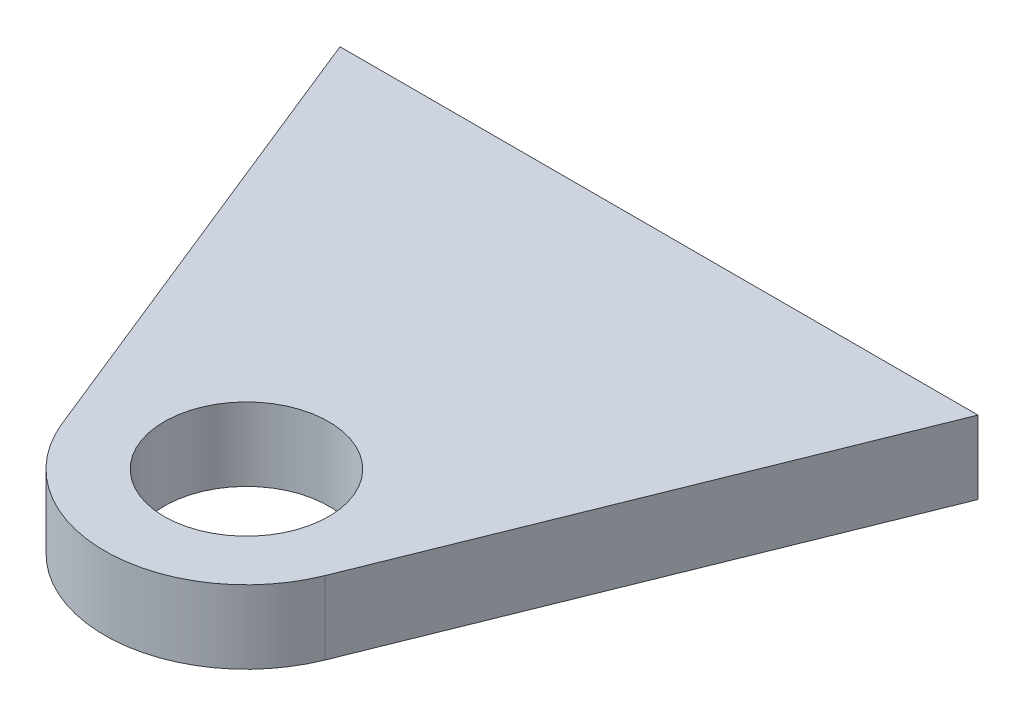
ISO-10303-21;
HEADER;
FILE_DESCRIPTION(('STEP AP214'),'2;1');
FILE_NAME('part.step','',(''),(''),'','','');
FILE_SCHEMA(('AUTOMOTIVE_DESIGN { 1 0 10303 214 1 1 1 1 }'));
ENDSEC;
DATA;
#1=APPLICATION_CONTEXT('core data for automotive mechanical design processes');
#2=APPLICATION_PROTOCOL_DEFINITION('international standard','automotive_design',2000,#1);
#3=PRODUCT_CONTEXT('',#1,'mechanical');
#4=PRODUCT('Part','Part','',(#3));
#5=PRODUCT_RELATED_PRODUCT_CATEGORY('part','',(#4));
#6=PRODUCT_DEFINITION_FORMATION('','',#4);
#7=PRODUCT_DEFINITION_CONTEXT('part definition',#1,'design');
#8=PRODUCT_DEFINITION('design','',#6,#7);
#9=PRODUCT_DEFINITION_SHAPE('','',#8);
#10=(LENGTH_UNIT() NAMED_UNIT(*) SI_UNIT(.MILLI.,.METRE.));
#11=(NAMED_UNIT(*) PLANE_ANGLE_UNIT() SI_UNIT($,.RADIAN.));
#12=(NAMED_UNIT(*) SI_UNIT($,.STERADIAN.) SOLID_ANGLE_UNIT());
#13=UNCERTAINTY_MEASURE_WITH_UNIT(LENGTH_MEASURE(1.E-05),#10,'distance_accuracy_value','');
#14=(GEOMETRIC_REPRESENTATION_CONTEXT(3) GLOBAL_UNCERTAINTY_ASSIGNED_CONTEXT((#13)) GLOBAL_UNIT_ASSIGNED_CONTEXT((#10,
#11,#12)) REPRESENTATION_CONTEXT('',''));
#15=CARTESIAN_POINT('',(0.,0.,0.));
#16=DIRECTION('',(0.,0.,1.));
#17=DIRECTION('',(1.,0.,0.));
#18=AXIS2_PLACEMENT_3D('',#15,#16,#17);
#19=CARTESIAN_POINT('',(-4.94323011635662,-1.6383,0.403487150332463));
#20=DIRECTION('',(-0.927587889016425,0.,0.373605016227102));
#21=DIRECTION('',(0.373605016227102,0.,0.927587889016425));
#22=AXIS2_PLACEMENT_3D('',#19,#20,#21);
#23=PLANE('',#22);
#24=DIRECTION('',(0.373605016227102,0.,0.927587889016425));
#25=VECTOR('',#24,1.);
#26=CARTESIAN_POINT('',(-4.94323011635662,1.6383,0.403487150332463));
#27=LINE('',#26,#25);
#28=CARTESIAN_POINT('',(-14.2875,1.6383,-22.7965));
#29=VERTEX_POINT('',#28);
#30=CARTESIAN_POINT('',(-5.89018159645202,1.6383,-1.94760741818566));
#31=VERTEX_POINT('',#30);
#32=EDGE_CURVE('E55',#29,#31,#27,.T.);
#33=ORIENTED_EDGE('',*,*,#32,.F.);
#34=DIRECTION('',(0.,1.,0.));
#35=VECTOR('',#34,1.);
#36=CARTESIAN_POINT('',(-14.2875,-1.6383,-22.7965));
#37=LINE('',#36,#35);
#38=CARTESIAN_POINT('',(-14.2875,-1.6383,-22.7965));
#39=VERTEX_POINT('',#38);
#40=EDGE_CURVE('E83',#39,#29,#37,.T.);
#41=ORIENTED_EDGE('',*,*,#40,.F.);
#42=DIRECTION('',(0.373605016227102,0.,0.927587889016425));
#43=VECTOR('',#42,1.);
#44=CARTESIAN_POINT('',(-4.94323011635662,-1.6383,0.403487150332463));
#45=LINE('',#44,#43);
#46=CARTESIAN_POINT('',(-5.89018159645202,-1.6383,-1.94760741818566));
#47=VERTEX_POINT('',#46);
#48=EDGE_CURVE('E57',#39,#47,#45,.T.);
#49=ORIENTED_EDGE('',*,*,#48,.T.);
#50=DIRECTION('',(0.,1.,0.));
#51=VECTOR('',#50,1.);
#52=CARTESIAN_POINT('',(-5.8901830952543,-1.6383,-1.9476111394174));
#53=LINE('',#52,#51);
#54=EDGE_CURVE('E9',#47,#31,#53,.T.);
#55=ORIENTED_EDGE('',*,*,#54,.T.);
#56=EDGE_LOOP('',(#33,#41,#49,#55));
#57=FACE_BOUND('',#56,.T.);
#58=ADVANCED_FACE('F15',(#57),#23,.T.);
#59=CARTESIAN_POINT('',(0.,-1.6383,-4.32000299245949));
#60=DIRECTION('',(0.,1.,0.));
#61=DIRECTION('',(0.,0.,1.));
#62=AXIS2_PLACEMENT_3D('',#59,#60,#61);
#63=CYLINDRICAL_SURFACE('',#62,6.35);
#64=CARTESIAN_POINT('',(0.,1.6383,-4.32000299245949));
#65=DIRECTION('',(0.,1.,0.));
#66=DIRECTION('',(1.,0.,0.));
#67=AXIS2_PLACEMENT_3D('',#64,#65,#66);
#68=CIRCLE('',#67,6.35);
#69=CARTESIAN_POINT('',(5.89018159720664,1.6383,-1.94760742005924));
#70=VERTEX_POINT('',#69);
#71=EDGE_CURVE('E62',#31,#70,#68,.T.);
#72=ORIENTED_EDGE('',*,*,#71,.F.);
#73=ORIENTED_EDGE('',*,*,#54,.F.);
#74=CARTESIAN_POINT('',(0.,-1.6383,-4.32000299245949));
#75=DIRECTION('',(0.,1.,0.));
#76=DIRECTION('',(1.,0.,0.));
#77=AXIS2_PLACEMENT_3D('',#74,#75,#76);
#78=CIRCLE('',#77,6.35);
#79=CARTESIAN_POINT('',(5.89018159720664,-1.6383,-1.94760742005924));
#80=VERTEX_POINT('',#79);
#81=EDGE_CURVE('E87',#47,#80,#78,.T.);
#82=ORIENTED_EDGE('',*,*,#81,.T.);
#83=DIRECTION('',(0.,-1.,0.));
#84=VECTOR('',#83,1.);
#85=CARTESIAN_POINT('',(5.8901830952543,-1.6383,-1.94761113941739));
#86=LINE('',#85,#84);
#87=EDGE_CURVE('E25',#80,#70,#86,.F.);
#88=ORIENTED_EDGE('',*,*,#87,.T.);
#89=EDGE_LOOP('',(#72,#73,#82,#88));
#90=FACE_BOUND('',#89,.T.);
#91=ADVANCED_FACE('F17',(#90),#63,.T.);
#92=CARTESIAN_POINT('',(4.94323011635662,-1.6383,0.403487150332463));
#93=DIRECTION('',(0.927587889016425,0.,0.373605016227102));
#94=DIRECTION('',(0.373605016227102,0.,-0.927587889016425));
#95=AXIS2_PLACEMENT_3D('',#92,#93,#94);
#96=PLANE('',#95);
#97=DIRECTION('',(0.373605016227102,0.,-0.927587889016425));
#98=VECTOR('',#97,1.);
#99=CARTESIAN_POINT('',(4.94323011635662,1.6383,0.403487150332463));
#100=LINE('',#99,#98);
#101=CARTESIAN_POINT('',(14.2875,1.6383,-22.7965));
#102=VERTEX_POINT('',#101);
#103=EDGE_CURVE('E67',#70,#102,#100,.T.);
#104=ORIENTED_EDGE('',*,*,#103,.F.);
#105=ORIENTED_EDGE('',*,*,#87,.F.);
#106=DIRECTION('',(0.373605016227102,0.,-0.927587889016425));
#107=VECTOR('',#106,1.);
#108=CARTESIAN_POINT('',(4.94323011635662,-1.6383,0.403487150332463));
#109=LINE('',#108,#107);
#110=CARTESIAN_POINT('',(14.2875,-1.6383,-22.7965));
#111=VERTEX_POINT('',#110);
#112=EDGE_CURVE('E84',#80,#111,#109,.T.);
#113=ORIENTED_EDGE('',*,*,#112,.T.);
#114=DIRECTION('',(0.,1.,0.));
#115=VECTOR('',#114,1.);
#116=CARTESIAN_POINT('',(14.2875,-1.6383,-22.7965));
#117=LINE('',#116,#115);
#118=EDGE_CURVE('E80',#111,#102,#117,.T.);
#119=ORIENTED_EDGE('',*,*,#118,.T.);
#120=EDGE_LOOP('',(#104,#105,#113,#119));
#121=FACE_BOUND('',#120,.T.);
#122=ADVANCED_FACE('F120',(#121),#96,.T.);
#123=CARTESIAN_POINT('',(0.,-1.6383,-4.32000299245949));
#124=DIRECTION('',(0.,1.,0.));
#125=DIRECTION('',(0.,0.,1.));
#126=AXIS2_PLACEMENT_3D('',#123,#124,#125);
#127=CYLINDRICAL_SURFACE('',#126,3.683);
#128=CARTESIAN_POINT('',(0.,-1.6383,-4.32000299245949));
#129=DIRECTION('',(0.,1.,0.));
#130=DIRECTION('',(1.,0.,0.));
#131=AXIS2_PLACEMENT_3D('',#128,#129,#130);
#132=CIRCLE('',#131,3.683);
#133=CARTESIAN_POINT('',(0.,-1.6383,-0.637002992459493));
#134=VERTEX_POINT('',#133);
#135=EDGE_CURVE('E90',#134,#134,#132,.T.);
#136=CARTESIAN_POINT('',(0.,1.6383,-4.32000299245949));
#137=DIRECTION('',(0.,1.,0.));
#138=DIRECTION('',(1.,0.,0.));
#139=AXIS2_PLACEMENT_3D('',#136,#137,#138);
#140=CIRCLE('',#139,3.683);
#141=CARTESIAN_POINT('',(0.,1.6383,-0.637002992459493));
#142=VERTEX_POINT('',#141);
#143=EDGE_CURVE('E19',#142,#142,#140,.T.);
#144=CARTESIAN_POINT('',(0.,-1.6383,-0.637002992459493));
#145=CARTESIAN_POINT('',(0.,-1.60416875,-0.637002992459493));
#146=CARTESIAN_POINT('',(0.,-1.5700375,-0.637002992459493));
#147=CARTESIAN_POINT('',(0.,-1.501775,-0.637002992459493));
#148=CARTESIAN_POINT('',(0.,-1.46764375,-0.637002992459493));
#149=CARTESIAN_POINT('',(0.,-1.39938125,-0.637002992459493));
#150=CARTESIAN_POINT('',(0.,-1.36525,-0.637002992459493));
#151=CARTESIAN_POINT('',(0.,-1.2969875,-0.637002992459493));
#152=CARTESIAN_POINT('',(0.,-1.26285625,-0.637002992459493));
#153=CARTESIAN_POINT('',(0.,-1.19459375,-0.637002992459493));
#154=CARTESIAN_POINT('',(0.,-1.1604625,-0.637002992459493));
#155=CARTESIAN_POINT('',(0.,-1.0922,-0.637002992459493));
#156=CARTESIAN_POINT('',(0.,-1.05806875,-0.637002992459493));
#157=CARTESIAN_POINT('',(0.,-0.98980625,-0.637002992459493));
#158=CARTESIAN_POINT('',(0.,-0.955675,-0.637002992459493));
#159=CARTESIAN_POINT('',(0.,-0.8874125,-0.637002992459493));
#160=CARTESIAN_POINT('',(0.,-0.85328125,-0.637002992459493));
#161=CARTESIAN_POINT('',(0.,-0.78501875,-0.637002992459493));
#162=CARTESIAN_POINT('',(0.,-0.7508875,-0.637002992459493));
#163=CARTESIAN_POINT('',(0.,-0.682625,-0.637002992459493));
#164=CARTESIAN_POINT('',(0.,-0.64849375,-0.637002992459493));
#165=CARTESIAN_POINT('',(0.,-0.58023125,-0.637002992459493));
#166=CARTESIAN_POINT('',(0.,-0.5461,-0.637002992459493));
#167=CARTESIAN_POINT('',(0.,-0.4778375,-0.637002992459493));
#168=CARTESIAN_POINT('',(0.,-0.443706250000001,-0.637002992459493));
#169=CARTESIAN_POINT('',(0.,-0.375443750000001,-0.637002992459493));
#170=CARTESIAN_POINT('',(0.,-0.3413125,-0.637002992459493));
#171=CARTESIAN_POINT('',(0.,-0.27305,-0.637002992459493));
#172=CARTESIAN_POINT('',(0.,-0.23891875,-0.637002992459493));
#173=CARTESIAN_POINT('',(0.,-0.17065625,-0.637002992459493));
#174=CARTESIAN_POINT('',(0.,-0.136525,-0.637002992459493));
#175=CARTESIAN_POINT('',(0.,-0.0682625000000004,-0.637002992459493));
#176=CARTESIAN_POINT('',(0.,-0.0341312500000004,-0.637002992459493));
#177=CARTESIAN_POINT('',(0.,0.0341312499999995,-0.637002992459493));
#178=CARTESIAN_POINT('',(0.,0.0682624999999995,-0.637002992459493));
#179=CARTESIAN_POINT('',(0.,0.136525,-0.637002992459493));
#180=CARTESIAN_POINT('',(0.,0.17065625,-0.637002992459493));
#181=CARTESIAN_POINT('',(0.,0.23891875,-0.637002992459493));
#182=CARTESIAN_POINT('',(0.,0.27305,-0.637002992459493));
#183=CARTESIAN_POINT('',(0.,0.3413125,-0.637002992459493));
#184=CARTESIAN_POINT('',(0.,0.37544375,-0.637002992459493));
#185=CARTESIAN_POINT('',(0.,0.44370625,-0.637002992459493));
#186=CARTESIAN_POINT('',(0.,0.477837499999999,-0.637002992459493));
#187=CARTESIAN_POINT('',(0.,0.546099999999999,-0.637002992459493));
#188=CARTESIAN_POINT('',(0.,0.58023125,-0.637002992459493));
#189=CARTESIAN_POINT('',(0.,0.64849375,-0.637002992459493));
#190=CARTESIAN_POINT('',(0.,0.682625,-0.637002992459493));
#191=CARTESIAN_POINT('',(0.,0.7508875,-0.637002992459493));
#192=CARTESIAN_POINT('',(0.,0.785018749999999,-0.637002992459493));
#193=CARTESIAN_POINT('',(0.,0.853281249999999,-0.637002992459493));
#194=CARTESIAN_POINT('',(0.,0.887412499999999,-0.637002992459493));
#195=CARTESIAN_POINT('',(0.,0.955675,-0.637002992459493));
#196=CARTESIAN_POINT('',(0.,0.98980625,-0.637002992459493));
#197=CARTESIAN_POINT('',(0.,1.05806875,-0.637002992459493));
#198=CARTESIAN_POINT('',(0.,1.0922,-0.637002992459493));
#199=CARTESIAN_POINT('',(0.,1.1604625,-0.637002992459493));
#200=CARTESIAN_POINT('',(0.,1.19459375,-0.637002992459493));
#201=CARTESIAN_POINT('',(0.,1.26285625,-0.637002992459493));
#202=CARTESIAN_POINT('',(0.,1.2969875,-0.637002992459493));
#203=CARTESIAN_POINT('',(0.,1.36525,-0.637002992459493));
#204=CARTESIAN_POINT('',(0.,1.39938125,-0.637002992459493));
#205=CARTESIAN_POINT('',(0.,1.46764375,-0.637002992459493));
#206=CARTESIAN_POINT('',(0.,1.501775,-0.637002992459493));
#207=CARTESIAN_POINT('',(0.,1.5700375,-0.637002992459493));
#208=CARTESIAN_POINT('',(0.,1.60416875,-0.637002992459493));
#209=CARTESIAN_POINT('',(0.,1.6383,-0.637002992459493));
#210=B_SPLINE_CURVE_WITH_KNOTS('',3,(#144,#145,#146,#147,#148,#149,#150,#151,#152,#153,#154,
#155,#156,#157,#158,#159,#160,#161,#162,#163,#164,#165,#166,#167,#168,#169,#170,#171,#172,#173,
#174,#175,#176,#177,#178,#179,#180,#181,#182,#183,#184,#185,#186,#187,#188,#189,#190,#191,#192,
#193,#194,#195,#196,#197,#198,#199,#200,#201,#202,#203,#204,#205,#206,#207,#208,#209),
.UNSPECIFIED.,.F.,.F.,(4,2,2,2,2,2,2,2,2,2,2,2,2,2,2,2,2,2,2,2,2,2,2,2,2,2,2,2,2,2,2,2,4),(0.,
0.10239375,0.2047875,0.30718125,0.409575,0.51196875,0.6143625,0.71675625,0.81915,0.92154375,
1.0239375,1.12633125,1.228725,1.33111875,1.4335125,1.53590625,1.6383,1.74069375,1.8430875,
1.94548125,2.047875,2.15026875,2.2526625,2.35505625,2.45745,2.55984375,2.6622375,2.76463125,
2.867025,2.96941875,3.0718125,3.17420625,3.2766),.UNSPECIFIED.);
#211=EDGE_CURVE('BSEAM103',#134,#142,#210,.T.);
#212=ORIENTED_EDGE('',*,*,#135,.F.);
#213=ORIENTED_EDGE('',*,*,#143,.T.);
#214=ORIENTED_EDGE('',*,*,#211,.T.);
#215=ORIENTED_EDGE('',*,*,#211,.F.);
#216=EDGE_LOOP('',(#212,#214,#213,#215));
#217=FACE_BOUND('',#216,.T.);
#218=ADVANCED_FACE('F103',(#217),#127,.F.);
#219=CARTESIAN_POINT('',(-15.3880715328182,-1.6383,-22.7965));
#220=DIRECTION('',(0.,0.,-1.));
#221=DIRECTION('',(-1.,0.,0.));
#222=AXIS2_PLACEMENT_3D('',#219,#220,#221);
#223=PLANE('',#222);
#224=DIRECTION('',(-1.,0.,0.));
#225=VECTOR('',#224,1.);
#226=CARTESIAN_POINT('',(-15.3880715328182,1.6383,-22.7965));
#227=LINE('',#226,#225);
#228=EDGE_CURVE('E71',#102,#29,#227,.T.);
#229=ORIENTED_EDGE('',*,*,#228,.F.);
#230=ORIENTED_EDGE('',*,*,#118,.F.);
#231=DIRECTION('',(-1.,0.,0.));
#232=VECTOR('',#231,1.);
#233=CARTESIAN_POINT('',(15.1511,-1.6383,-22.7965));
#234=LINE('',#233,#232);
#235=EDGE_CURVE('E33',#111,#39,#234,.T.);
#236=ORIENTED_EDGE('',*,*,#235,.T.);
#237=ORIENTED_EDGE('',*,*,#40,.T.);
#238=EDGE_LOOP('',(#229,#230,#236,#237));
#239=FACE_BOUND('',#238,.T.);
#240=ADVANCED_FACE('F112',(#239),#223,.T.);
#241=CARTESIAN_POINT('',(0.,-1.6383,-1.5875));
#242=DIRECTION('',(0.,1.,0.));
#243=DIRECTION('',(0.,0.,1.));
#244=AXIS2_PLACEMENT_3D('',#241,#242,#243);
#245=PLANE('',#244);
#246=ORIENTED_EDGE('',*,*,#135,.T.);
#247=EDGE_LOOP('',(#246));
#248=FACE_BOUND('',#247,.T.);
#249=ORIENTED_EDGE('',*,*,#48,.F.);
#250=ORIENTED_EDGE('',*,*,#235,.F.);
#251=ORIENTED_EDGE('',*,*,#112,.F.);
#252=ORIENTED_EDGE('',*,*,#81,.F.);
#253=EDGE_LOOP('',(#249,#250,#251,#252));
#254=FACE_BOUND('',#253,.T.);
#255=ADVANCED_FACE('F106',(#248,#254),#245,.F.);
#256=CARTESIAN_POINT('',(0.,1.6383,-1.5875));
#257=DIRECTION('',(0.,1.,0.));
#258=DIRECTION('',(0.,0.,1.));
#259=AXIS2_PLACEMENT_3D('',#256,#257,#258);
#260=PLANE('',#259);
#261=ORIENTED_EDGE('',*,*,#143,.F.);
#262=EDGE_LOOP('',(#261));
#263=FACE_BOUND('',#262,.T.);
#264=ORIENTED_EDGE('',*,*,#32,.T.);
#265=ORIENTED_EDGE('',*,*,#71,.T.);
#266=ORIENTED_EDGE('',*,*,#103,.T.);
#267=ORIENTED_EDGE('',*,*,#228,.T.);
#268=EDGE_LOOP('',(#264,#265,#266,#267));
#269=FACE_BOUND('',#268,.T.);
#270=ADVANCED_FACE('F70',(#263,#269),#260,.T.);
#271=CLOSED_SHELL('',(#58,#91,#122,#218,#240,#255,#270));
#272=MANIFOLD_SOLID_BREP('B1',#271);
#273=ADVANCED_BREP_SHAPE_REPRESENTATION('',(#18,#272),#14);
#274=SHAPE_DEFINITION_REPRESENTATION(#9,#273);
ENDSEC;
END-ISO-10303-21;
